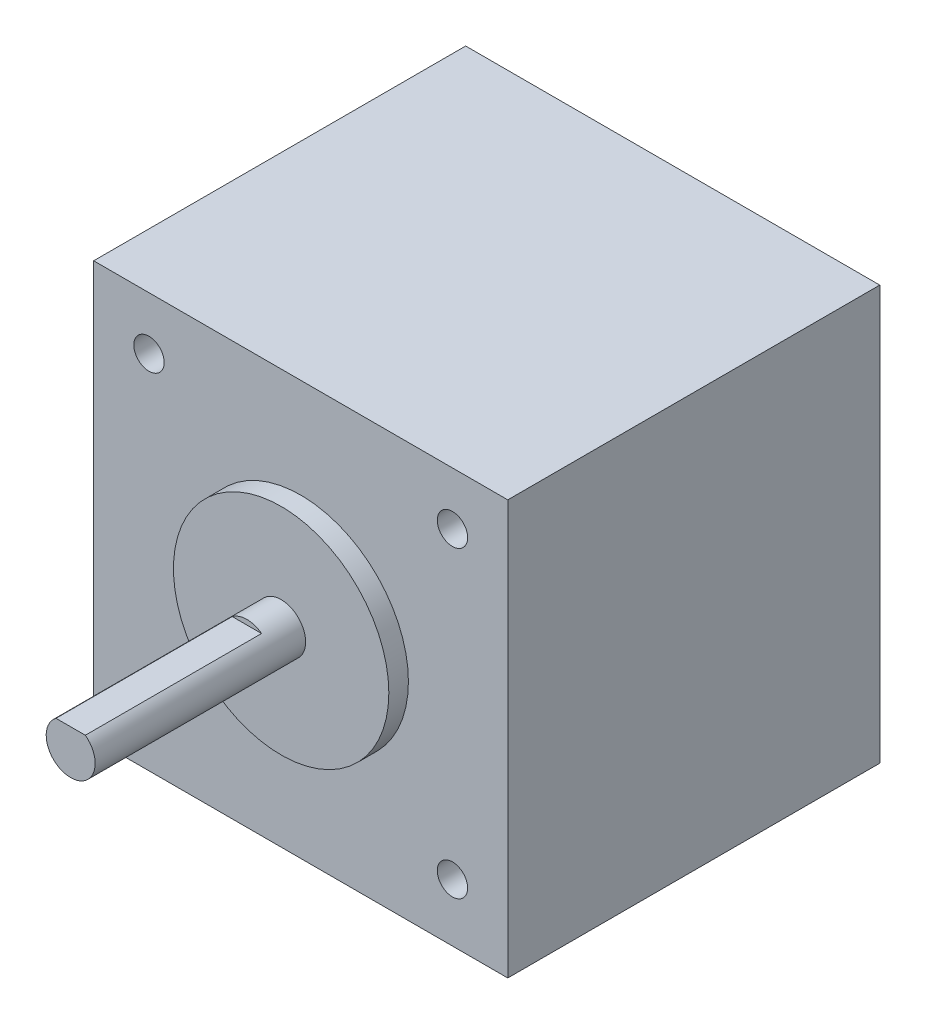
ISO-10303-21;
HEADER;
FILE_DESCRIPTION(('STEP AP214'),'2;1');
FILE_NAME('part.step','',(''),(''),'','','');
FILE_SCHEMA(('AUTOMOTIVE_DESIGN { 1 0 10303 214 1 1 1 1 }'));
ENDSEC;
DATA;
#1=APPLICATION_CONTEXT('core data for automotive mechanical design processes');
#2=APPLICATION_PROTOCOL_DEFINITION('international standard','automotive_design',2000,#1);
#3=PRODUCT_CONTEXT('',#1,'mechanical');
#4=PRODUCT('Part','Part','',(#3));
#5=PRODUCT_RELATED_PRODUCT_CATEGORY('part','',(#4));
#6=PRODUCT_DEFINITION_FORMATION('','',#4);
#7=PRODUCT_DEFINITION_CONTEXT('part definition',#1,'design');
#8=PRODUCT_DEFINITION('design','',#6,#7);
#9=PRODUCT_DEFINITION_SHAPE('','',#8);
#10=(LENGTH_UNIT() NAMED_UNIT(*) SI_UNIT(.MILLI.,.METRE.));
#11=(NAMED_UNIT(*) PLANE_ANGLE_UNIT() SI_UNIT($,.RADIAN.));
#12=(NAMED_UNIT(*) SI_UNIT($,.STERADIAN.) SOLID_ANGLE_UNIT());
#13=UNCERTAINTY_MEASURE_WITH_UNIT(LENGTH_MEASURE(1.E-05),#10,'distance_accuracy_value','');
#14=(GEOMETRIC_REPRESENTATION_CONTEXT(3) GLOBAL_UNCERTAINTY_ASSIGNED_CONTEXT((#13)) GLOBAL_UNIT_ASSIGNED_CONTEXT((#10,
#11,#12)) REPRESENTATION_CONTEXT('',''));
#15=CARTESIAN_POINT('',(0.,0.,0.));
#16=DIRECTION('',(0.,0.,1.));
#17=DIRECTION('',(1.,0.,0.));
#18=AXIS2_PLACEMENT_3D('',#15,#16,#17);
#19=CARTESIAN_POINT('',(0.,0.,38.));
#20=DIRECTION('',(1.,0.,0.));
#21=DIRECTION('',(0.,0.,-1.));
#22=AXIS2_PLACEMENT_3D('',#19,#20,#21);
#23=PLANE('',#22);
#24=DIRECTION('',(0.,-1.,0.));
#25=VECTOR('',#24,1.);
#26=CARTESIAN_POINT('',(0.,0.,0.));
#27=LINE('',#26,#25);
#28=CARTESIAN_POINT('',(0.,42.3,0.));
#29=VERTEX_POINT('',#28);
#30=CARTESIAN_POINT('',(0.,0.,0.));
#31=VERTEX_POINT('',#30);
#32=EDGE_CURVE('E122',#29,#31,#27,.T.);
#33=ORIENTED_EDGE('',*,*,#32,.T.);
#34=DIRECTION('',(0.,0.,-1.));
#35=VECTOR('',#34,1.);
#36=CARTESIAN_POINT('',(0.,0.,38.));
#37=LINE('',#36,#35);
#38=CARTESIAN_POINT('',(0.,0.,38.));
#39=VERTEX_POINT('',#38);
#40=EDGE_CURVE('E36',#39,#31,#37,.T.);
#41=ORIENTED_EDGE('',*,*,#40,.F.);
#42=DIRECTION('',(0.,-1.,0.));
#43=VECTOR('',#42,1.);
#44=CARTESIAN_POINT('',(0.,0.,38.));
#45=LINE('',#44,#43);
#46=CARTESIAN_POINT('',(0.,42.3,38.));
#47=VERTEX_POINT('',#46);
#48=EDGE_CURVE('E125',#47,#39,#45,.T.);
#49=ORIENTED_EDGE('',*,*,#48,.F.);
#50=DIRECTION('',(0.,0.,-1.));
#51=VECTOR('',#50,1.);
#52=CARTESIAN_POINT('',(0.,42.3,38.));
#53=LINE('',#52,#51);
#54=EDGE_CURVE('E79',#47,#29,#53,.T.);
#55=ORIENTED_EDGE('',*,*,#54,.T.);
#56=EDGE_LOOP('',(#33,#41,#49,#55));
#57=FACE_BOUND('',#56,.T.);
#58=ADVANCED_FACE('F33',(#57),#23,.F.);
#59=CARTESIAN_POINT('',(0.,0.,38.));
#60=DIRECTION('',(0.,1.,0.));
#61=DIRECTION('',(0.,0.,1.));
#62=AXIS2_PLACEMENT_3D('',#59,#60,#61);
#63=PLANE('',#62);
#64=DIRECTION('',(1.,0.,0.));
#65=VECTOR('',#64,1.);
#66=CARTESIAN_POINT('',(0.,0.,0.));
#67=LINE('',#66,#65);
#68=CARTESIAN_POINT('',(42.3,0.,0.));
#69=VERTEX_POINT('',#68);
#70=EDGE_CURVE('E133',#31,#69,#67,.T.);
#71=ORIENTED_EDGE('',*,*,#70,.T.);
#72=DIRECTION('',(0.,0.,-1.));
#73=VECTOR('',#72,1.);
#74=CARTESIAN_POINT('',(42.3,0.,38.));
#75=LINE('',#74,#73);
#76=CARTESIAN_POINT('',(42.3,0.,38.));
#77=VERTEX_POINT('',#76);
#78=EDGE_CURVE('E142',#77,#69,#75,.T.);
#79=ORIENTED_EDGE('',*,*,#78,.F.);
#80=DIRECTION('',(1.,0.,0.));
#81=VECTOR('',#80,1.);
#82=CARTESIAN_POINT('',(0.,0.,38.));
#83=LINE('',#82,#81);
#84=EDGE_CURVE('E86',#39,#77,#83,.T.);
#85=ORIENTED_EDGE('',*,*,#84,.F.);
#86=ORIENTED_EDGE('',*,*,#40,.T.);
#87=EDGE_LOOP('',(#71,#79,#85,#86));
#88=FACE_BOUND('',#87,.T.);
#89=ADVANCED_FACE('F147',(#88),#63,.F.);
#90=CARTESIAN_POINT('',(42.3,0.,38.));
#91=DIRECTION('',(-1.,0.,0.));
#92=DIRECTION('',(0.,0.,1.));
#93=AXIS2_PLACEMENT_3D('',#90,#91,#92);
#94=PLANE('',#93);
#95=DIRECTION('',(0.,1.,0.));
#96=VECTOR('',#95,1.);
#97=CARTESIAN_POINT('',(42.3,0.,0.));
#98=LINE('',#97,#96);
#99=CARTESIAN_POINT('',(42.3,42.3,0.));
#100=VERTEX_POINT('',#99);
#101=EDGE_CURVE('E136',#69,#100,#98,.T.);
#102=ORIENTED_EDGE('',*,*,#101,.T.);
#103=DIRECTION('',(0.,0.,-1.));
#104=VECTOR('',#103,1.);
#105=CARTESIAN_POINT('',(42.3,42.3,38.));
#106=LINE('',#105,#104);
#107=CARTESIAN_POINT('',(42.3,42.3,38.));
#108=VERTEX_POINT('',#107);
#109=EDGE_CURVE('E141',#108,#100,#106,.T.);
#110=ORIENTED_EDGE('',*,*,#109,.F.);
#111=DIRECTION('',(0.,1.,0.));
#112=VECTOR('',#111,1.);
#113=CARTESIAN_POINT('',(42.3,0.,38.));
#114=LINE('',#113,#112);
#115=EDGE_CURVE('E129',#77,#108,#114,.T.);
#116=ORIENTED_EDGE('',*,*,#115,.F.);
#117=ORIENTED_EDGE('',*,*,#78,.T.);
#118=EDGE_LOOP('',(#102,#110,#116,#117));
#119=FACE_BOUND('',#118,.T.);
#120=ADVANCED_FACE('F157',(#119),#94,.F.);
#121=CARTESIAN_POINT('',(0.,42.3,38.));
#122=DIRECTION('',(0.,-1.,0.));
#123=DIRECTION('',(0.,0.,-1.));
#124=AXIS2_PLACEMENT_3D('',#121,#122,#123);
#125=PLANE('',#124);
#126=DIRECTION('',(-1.,0.,0.));
#127=VECTOR('',#126,1.);
#128=CARTESIAN_POINT('',(0.,42.3,0.));
#129=LINE('',#128,#127);
#130=EDGE_CURVE('E127',#100,#29,#129,.T.);
#131=ORIENTED_EDGE('',*,*,#130,.T.);
#132=ORIENTED_EDGE('',*,*,#54,.F.);
#133=DIRECTION('',(-1.,0.,0.));
#134=VECTOR('',#133,1.);
#135=CARTESIAN_POINT('',(0.,42.3,38.));
#136=LINE('',#135,#134);
#137=EDGE_CURVE('E58',#108,#47,#136,.T.);
#138=ORIENTED_EDGE('',*,*,#137,.F.);
#139=ORIENTED_EDGE('',*,*,#109,.T.);
#140=EDGE_LOOP('',(#131,#132,#138,#139));
#141=FACE_BOUND('',#140,.T.);
#142=ADVANCED_FACE('F161',(#141),#125,.F.);
#143=CARTESIAN_POINT('',(0.,0.,38.));
#144=DIRECTION('',(0.,0.,-1.));
#145=DIRECTION('',(-1.,0.,0.));
#146=AXIS2_PLACEMENT_3D('',#143,#144,#145);
#147=PLANE('',#146);
#148=CARTESIAN_POINT('',(5.65,5.9,38.));
#149=DIRECTION('',(0.,0.,1.));
#150=DIRECTION('',(1.,0.,0.));
#151=AXIS2_PLACEMENT_3D('',#148,#149,#150);
#152=CIRCLE('',#151,1.55);
#153=CARTESIAN_POINT('',(7.2,5.9,38.));
#154=VERTEX_POINT('',#153);
#155=EDGE_CURVE('E281',#154,#154,#152,.T.);
#156=ORIENTED_EDGE('',*,*,#155,.F.);
#157=EDGE_LOOP('',(#156));
#158=FACE_BOUND('',#157,.T.);
#159=CARTESIAN_POINT('',(36.65,5.9,38.));
#160=DIRECTION('',(0.,0.,1.));
#161=DIRECTION('',(1.,0.,0.));
#162=AXIS2_PLACEMENT_3D('',#159,#160,#161);
#163=CIRCLE('',#162,1.55);
#164=CARTESIAN_POINT('',(38.2,5.9,38.));
#165=VERTEX_POINT('',#164);
#166=EDGE_CURVE('E294',#165,#165,#163,.T.);
#167=ORIENTED_EDGE('',*,*,#166,.F.);
#168=EDGE_LOOP('',(#167));
#169=FACE_BOUND('',#168,.T.);
#170=CARTESIAN_POINT('',(36.65,36.9,38.));
#171=DIRECTION('',(0.,0.,1.));
#172=DIRECTION('',(1.,0.,0.));
#173=AXIS2_PLACEMENT_3D('',#170,#171,#172);
#174=CIRCLE('',#173,1.55);
#175=CARTESIAN_POINT('',(38.2,36.9,38.));
#176=VERTEX_POINT('',#175);
#177=EDGE_CURVE('E288',#176,#176,#174,.T.);
#178=ORIENTED_EDGE('',*,*,#177,.F.);
#179=EDGE_LOOP('',(#178));
#180=FACE_BOUND('',#179,.T.);
#181=CARTESIAN_POINT('',(5.65,36.9,38.));
#182=DIRECTION('',(0.,0.,1.));
#183=DIRECTION('',(1.,0.,0.));
#184=AXIS2_PLACEMENT_3D('',#181,#182,#183);
#185=CIRCLE('',#184,1.55);
#186=CARTESIAN_POINT('',(7.2,36.9,38.));
#187=VERTEX_POINT('',#186);
#188=EDGE_CURVE('E287',#187,#187,#185,.T.);
#189=ORIENTED_EDGE('',*,*,#188,.F.);
#190=EDGE_LOOP('',(#189));
#191=FACE_BOUND('',#190,.T.);
#192=CARTESIAN_POINT('',(21.15,21.15,38.));
#193=DIRECTION('',(0.,0.,1.));
#194=DIRECTION('',(1.,0.,0.));
#195=AXIS2_PLACEMENT_3D('',#192,#193,#194);
#196=CIRCLE('',#195,11.);
#197=CARTESIAN_POINT('',(32.15,21.15,38.));
#198=VERTEX_POINT('',#197);
#199=EDGE_CURVE('E41',#198,#198,#196,.T.);
#200=ORIENTED_EDGE('',*,*,#199,.F.);
#201=EDGE_LOOP('',(#200));
#202=FACE_BOUND('',#201,.T.);
#203=ORIENTED_EDGE('',*,*,#48,.T.);
#204=ORIENTED_EDGE('',*,*,#84,.T.);
#205=ORIENTED_EDGE('',*,*,#115,.T.);
#206=ORIENTED_EDGE('',*,*,#137,.T.);
#207=EDGE_LOOP('',(#203,#204,#205,#206));
#208=FACE_BOUND('',#207,.T.);
#209=ADVANCED_FACE('F166',(#158,#169,#180,#191,#202,#208),#147,.F.);
#210=CARTESIAN_POINT('',(0.,0.,0.));
#211=DIRECTION('',(0.,0.,-1.));
#212=DIRECTION('',(-1.,0.,0.));
#213=AXIS2_PLACEMENT_3D('',#210,#211,#212);
#214=PLANE('',#213);
#215=CARTESIAN_POINT('',(36.65,36.9,0.));
#216=DIRECTION('',(0.,0.,-1.));
#217=DIRECTION('',(-1.,0.,0.));
#218=AXIS2_PLACEMENT_3D('',#215,#216,#217);
#219=CIRCLE('',#218,1.55);
#220=CARTESIAN_POINT('',(35.1,36.9,0.));
#221=VERTEX_POINT('',#220);
#222=EDGE_CURVE('E273',#221,#221,#219,.T.);
#223=ORIENTED_EDGE('',*,*,#222,.F.);
#224=EDGE_LOOP('',(#223));
#225=FACE_BOUND('',#224,.T.);
#226=CARTESIAN_POINT('',(36.65,5.9,0.));
#227=DIRECTION('',(0.,0.,-1.));
#228=DIRECTION('',(-1.,0.,0.));
#229=AXIS2_PLACEMENT_3D('',#226,#227,#228);
#230=CIRCLE('',#229,1.55);
#231=CARTESIAN_POINT('',(35.1,5.9,0.));
#232=VERTEX_POINT('',#231);
#233=EDGE_CURVE('E260',#232,#232,#230,.T.);
#234=ORIENTED_EDGE('',*,*,#233,.F.);
#235=EDGE_LOOP('',(#234));
#236=FACE_BOUND('',#235,.T.);
#237=CARTESIAN_POINT('',(5.65,5.9,0.));
#238=DIRECTION('',(0.,0.,-1.));
#239=DIRECTION('',(-1.,0.,0.));
#240=AXIS2_PLACEMENT_3D('',#237,#238,#239);
#241=CIRCLE('',#240,1.55);
#242=CARTESIAN_POINT('',(4.1,5.9,0.));
#243=VERTEX_POINT('',#242);
#244=EDGE_CURVE('E261',#243,#243,#241,.T.);
#245=ORIENTED_EDGE('',*,*,#244,.F.);
#246=EDGE_LOOP('',(#245));
#247=FACE_BOUND('',#246,.T.);
#248=CARTESIAN_POINT('',(5.65,36.9,0.));
#249=DIRECTION('',(0.,0.,-1.));
#250=DIRECTION('',(-1.,0.,0.));
#251=AXIS2_PLACEMENT_3D('',#248,#249,#250);
#252=CIRCLE('',#251,1.55);
#253=CARTESIAN_POINT('',(4.1,36.9,0.));
#254=VERTEX_POINT('',#253);
#255=EDGE_CURVE('E272',#254,#254,#252,.T.);
#256=ORIENTED_EDGE('',*,*,#255,.F.);
#257=EDGE_LOOP('',(#256));
#258=FACE_BOUND('',#257,.T.);
#259=ORIENTED_EDGE('',*,*,#32,.F.);
#260=ORIENTED_EDGE('',*,*,#130,.F.);
#261=ORIENTED_EDGE('',*,*,#101,.F.);
#262=ORIENTED_EDGE('',*,*,#70,.F.);
#263=EDGE_LOOP('',(#259,#260,#261,#262));
#264=FACE_BOUND('',#263,.T.);
#265=ADVANCED_FACE('F151',(#225,#236,#247,#258,#264),#214,.T.);
#266=CARTESIAN_POINT('',(21.15,21.15,40.));
#267=DIRECTION('',(0.,0.,-1.));
#268=DIRECTION('',(-1.,0.,0.));
#269=AXIS2_PLACEMENT_3D('',#266,#267,#268);
#270=CYLINDRICAL_SURFACE('',#269,11.);
#271=CARTESIAN_POINT('',(21.15,21.15,40.));
#272=DIRECTION('',(0.,0.,1.));
#273=DIRECTION('',(1.,0.,0.));
#274=AXIS2_PLACEMENT_3D('',#271,#272,#273);
#275=CIRCLE('',#274,11.);
#276=CARTESIAN_POINT('',(32.15,21.15,40.));
#277=VERTEX_POINT('',#276);
#278=EDGE_CURVE('E118',#277,#277,#275,.T.);
#279=ORIENTED_EDGE('',*,*,#278,.F.);
#280=EDGE_LOOP('',(#279));
#281=FACE_BOUND('',#280,.T.);
#282=ORIENTED_EDGE('',*,*,#199,.T.);
#283=EDGE_LOOP('',(#282));
#284=FACE_BOUND('',#283,.T.);
#285=ADVANCED_FACE('F170',(#281,#284),#270,.T.);
#286=CARTESIAN_POINT('',(21.15,21.15,40.));
#287=DIRECTION('',(0.,0.,1.));
#288=DIRECTION('',(1.,0.,0.));
#289=AXIS2_PLACEMENT_3D('',#286,#287,#288);
#290=PLANE('',#289);
#291=CARTESIAN_POINT('',(21.15,21.4,40.));
#292=DIRECTION('',(0.,0.,1.));
#293=DIRECTION('',(1.,0.,0.));
#294=AXIS2_PLACEMENT_3D('',#291,#292,#293);
#295=CIRCLE('',#294,2.5);
#296=CARTESIAN_POINT('',(23.65,21.4,40.));
#297=VERTEX_POINT('',#296);
#298=EDGE_CURVE('E12',#297,#297,#295,.T.);
#299=ORIENTED_EDGE('',*,*,#298,.F.);
#300=EDGE_LOOP('',(#299));
#301=FACE_BOUND('',#300,.T.);
#302=ORIENTED_EDGE('',*,*,#278,.T.);
#303=EDGE_LOOP('',(#302));
#304=FACE_BOUND('',#303,.T.);
#305=ADVANCED_FACE('F177',(#301,#304),#290,.T.);
#306=CARTESIAN_POINT('',(21.15,21.4,61.5));
#307=DIRECTION('',(0.,0.,-1.));
#308=DIRECTION('',(-1.,0.,0.));
#309=AXIS2_PLACEMENT_3D('',#306,#307,#308);
#310=CYLINDRICAL_SURFACE('',#309,2.5);
#311=CARTESIAN_POINT('',(21.15,21.4,61.5));
#312=DIRECTION('',(0.,0.,1.));
#313=DIRECTION('',(1.,0.,0.));
#314=AXIS2_PLACEMENT_3D('',#311,#312,#313);
#315=CIRCLE('',#314,2.5);
#316=CARTESIAN_POINT('',(19.65,23.4,61.5));
#317=VERTEX_POINT('',#316);
#318=CARTESIAN_POINT('',(22.65,23.4,61.5));
#319=VERTEX_POINT('',#318);
#320=EDGE_CURVE('E116',#317,#319,#315,.T.);
#321=ORIENTED_EDGE('',*,*,#320,.F.);
#322=DIRECTION('',(0.,0.,1.));
#323=VECTOR('',#322,1.);
#324=CARTESIAN_POINT('',(19.65,23.4,43.5));
#325=LINE('',#324,#323);
#326=CARTESIAN_POINT('',(19.65,23.4,43.5));
#327=VERTEX_POINT('',#326);
#328=EDGE_CURVE('E49',#327,#317,#325,.T.);
#329=ORIENTED_EDGE('',*,*,#328,.F.);
#330=CARTESIAN_POINT('',(21.15,21.4,43.5));
#331=DIRECTION('',(0.,0.,1.));
#332=DIRECTION('',(1.,0.,0.));
#333=AXIS2_PLACEMENT_3D('',#330,#331,#332);
#334=CIRCLE('',#333,2.5);
#335=CARTESIAN_POINT('',(22.65,23.4,43.5));
#336=VERTEX_POINT('',#335);
#337=EDGE_CURVE('E99',#336,#327,#334,.T.);
#338=ORIENTED_EDGE('',*,*,#337,.F.);
#339=DIRECTION('',(0.,0.,1.));
#340=VECTOR('',#339,1.);
#341=CARTESIAN_POINT('',(22.65,23.4,43.5));
#342=LINE('',#341,#340);
#343=EDGE_CURVE('E103',#336,#319,#342,.T.);
#344=ORIENTED_EDGE('',*,*,#343,.T.);
#345=EDGE_LOOP('',(#321,#329,#338,#344));
#346=FACE_BOUND('',#345,.T.);
#347=ORIENTED_EDGE('',*,*,#298,.T.);
#348=EDGE_LOOP('',(#347));
#349=FACE_BOUND('',#348,.T.);
#350=ADVANCED_FACE('F109',(#346,#349),#310,.T.);
#351=CARTESIAN_POINT('',(21.15,21.4,61.5));
#352=DIRECTION('',(0.,0.,1.));
#353=DIRECTION('',(1.,0.,0.));
#354=AXIS2_PLACEMENT_3D('',#351,#352,#353);
#355=PLANE('',#354);
#356=DIRECTION('',(1.,0.,0.));
#357=VECTOR('',#356,1.);
#358=CARTESIAN_POINT('',(21.15,23.4,61.5));
#359=LINE('',#358,#357);
#360=EDGE_CURVE('E100',#317,#319,#359,.T.);
#361=ORIENTED_EDGE('',*,*,#360,.F.);
#362=ORIENTED_EDGE('',*,*,#320,.T.);
#363=EDGE_LOOP('',(#361,#362));
#364=FACE_BOUND('',#363,.T.);
#365=ADVANCED_FACE('F184',(#364),#355,.T.);
#366=CARTESIAN_POINT('',(21.15,23.4,43.5));
#367=DIRECTION('',(0.,-1.,0.));
#368=DIRECTION('',(0.,0.,-1.));
#369=AXIS2_PLACEMENT_3D('',#366,#367,#368);
#370=PLANE('',#369);
#371=ORIENTED_EDGE('',*,*,#360,.T.);
#372=ORIENTED_EDGE('',*,*,#343,.F.);
#373=DIRECTION('',(1.,0.,0.));
#374=VECTOR('',#373,1.);
#375=CARTESIAN_POINT('',(21.15,23.4,43.5));
#376=LINE('',#375,#374);
#377=EDGE_CURVE('E95',#327,#336,#376,.T.);
#378=ORIENTED_EDGE('',*,*,#377,.F.);
#379=ORIENTED_EDGE('',*,*,#328,.T.);
#380=EDGE_LOOP('',(#371,#372,#378,#379));
#381=FACE_BOUND('',#380,.T.);
#382=ADVANCED_FACE('F104',(#381),#370,.F.);
#383=CARTESIAN_POINT('',(21.15,21.4,43.5));
#384=DIRECTION('',(0.,0.,1.));
#385=DIRECTION('',(1.,0.,0.));
#386=AXIS2_PLACEMENT_3D('',#383,#384,#385);
#387=PLANE('',#386);
#388=ORIENTED_EDGE('',*,*,#377,.T.);
#389=ORIENTED_EDGE('',*,*,#337,.T.);
#390=EDGE_LOOP('',(#388,#389));
#391=FACE_BOUND('',#390,.T.);
#392=ADVANCED_FACE('F97',(#391),#387,.T.);
#393=CARTESIAN_POINT('',(5.65,36.9,33.5));
#394=DIRECTION('',(0.,0.,1.));
#395=DIRECTION('',(1.,0.,0.));
#396=AXIS2_PLACEMENT_3D('',#393,#394,#395);
#397=CYLINDRICAL_SURFACE('',#396,1.55);
#398=CARTESIAN_POINT('',(5.65,36.9,33.5));
#399=DIRECTION('',(0.,0.,1.));
#400=DIRECTION('',(1.,0.,0.));
#401=AXIS2_PLACEMENT_3D('',#398,#399,#400);
#402=CIRCLE('',#401,1.55);
#403=CARTESIAN_POINT('',(7.2,36.9,33.5));
#404=VERTEX_POINT('',#403);
#405=EDGE_CURVE('E115',#404,#404,#402,.T.);
#406=ORIENTED_EDGE('',*,*,#405,.F.);
#407=EDGE_LOOP('',(#406));
#408=FACE_BOUND('',#407,.T.);
#409=ORIENTED_EDGE('',*,*,#188,.T.);
#410=EDGE_LOOP('',(#409));
#411=FACE_BOUND('',#410,.T.);
#412=ADVANCED_FACE('F192',(#408,#411),#397,.F.);
#413=CARTESIAN_POINT('',(5.65,36.9,33.5));
#414=DIRECTION('',(0.,0.,1.));
#415=DIRECTION('',(1.,0.,0.));
#416=AXIS2_PLACEMENT_3D('',#413,#414,#415);
#417=PLANE('',#416);
#418=ORIENTED_EDGE('',*,*,#405,.T.);
#419=EDGE_LOOP('',(#418));
#420=FACE_BOUND('',#419,.T.);
#421=ADVANCED_FACE('F195',(#420),#417,.T.);
#422=CARTESIAN_POINT('',(36.65,36.9,33.5));
#423=DIRECTION('',(0.,0.,1.));
#424=DIRECTION('',(1.,0.,0.));
#425=AXIS2_PLACEMENT_3D('',#422,#423,#424);
#426=CYLINDRICAL_SURFACE('',#425,1.55);
#427=CARTESIAN_POINT('',(36.65,36.9,33.5));
#428=DIRECTION('',(0.,0.,1.));
#429=DIRECTION('',(1.,0.,0.));
#430=AXIS2_PLACEMENT_3D('',#427,#428,#429);
#431=CIRCLE('',#430,1.55);
#432=CARTESIAN_POINT('',(38.2,36.9,33.5));
#433=VERTEX_POINT('',#432);
#434=EDGE_CURVE('E284',#433,#433,#431,.T.);
#435=ORIENTED_EDGE('',*,*,#434,.F.);
#436=EDGE_LOOP('',(#435));
#437=FACE_BOUND('',#436,.T.);
#438=ORIENTED_EDGE('',*,*,#177,.T.);
#439=EDGE_LOOP('',(#438));
#440=FACE_BOUND('',#439,.T.);
#441=ADVANCED_FACE('F199',(#437,#440),#426,.F.);
#442=CARTESIAN_POINT('',(36.65,36.9,33.5));
#443=DIRECTION('',(0.,0.,1.));
#444=DIRECTION('',(1.,0.,0.));
#445=AXIS2_PLACEMENT_3D('',#442,#443,#444);
#446=PLANE('',#445);
#447=ORIENTED_EDGE('',*,*,#434,.T.);
#448=EDGE_LOOP('',(#447));
#449=FACE_BOUND('',#448,.T.);
#450=ADVANCED_FACE('F214',(#449),#446,.T.);
#451=CARTESIAN_POINT('',(36.65,5.9,33.5));
#452=DIRECTION('',(0.,0.,1.));
#453=DIRECTION('',(1.,0.,0.));
#454=AXIS2_PLACEMENT_3D('',#451,#452,#453);
#455=CYLINDRICAL_SURFACE('',#454,1.55);
#456=CARTESIAN_POINT('',(36.65,5.9,33.5));
#457=DIRECTION('',(0.,0.,1.));
#458=DIRECTION('',(1.,0.,0.));
#459=AXIS2_PLACEMENT_3D('',#456,#457,#458);
#460=CIRCLE('',#459,1.55);
#461=CARTESIAN_POINT('',(38.2,5.9,33.5));
#462=VERTEX_POINT('',#461);
#463=EDGE_CURVE('E291',#462,#462,#460,.T.);
#464=ORIENTED_EDGE('',*,*,#463,.F.);
#465=EDGE_LOOP('',(#464));
#466=FACE_BOUND('',#465,.T.);
#467=ORIENTED_EDGE('',*,*,#166,.T.);
#468=EDGE_LOOP('',(#467));
#469=FACE_BOUND('',#468,.T.);
#470=ADVANCED_FACE('F211',(#466,#469),#455,.F.);
#471=CARTESIAN_POINT('',(36.65,5.9,33.5));
#472=DIRECTION('',(0.,0.,1.));
#473=DIRECTION('',(1.,0.,0.));
#474=AXIS2_PLACEMENT_3D('',#471,#472,#473);
#475=PLANE('',#474);
#476=ORIENTED_EDGE('',*,*,#463,.T.);
#477=EDGE_LOOP('',(#476));
#478=FACE_BOUND('',#477,.T.);
#479=ADVANCED_FACE('F205',(#478),#475,.T.);
#480=CARTESIAN_POINT('',(5.65,5.9,33.5));
#481=DIRECTION('',(0.,0.,1.));
#482=DIRECTION('',(1.,0.,0.));
#483=AXIS2_PLACEMENT_3D('',#480,#481,#482);
#484=CYLINDRICAL_SURFACE('',#483,1.55);
#485=CARTESIAN_POINT('',(5.65,5.9,33.5));
#486=DIRECTION('',(0.,0.,1.));
#487=DIRECTION('',(1.,0.,0.));
#488=AXIS2_PLACEMENT_3D('',#485,#486,#487);
#489=CIRCLE('',#488,1.55);
#490=CARTESIAN_POINT('',(7.2,5.9,33.5));
#491=VERTEX_POINT('',#490);
#492=EDGE_CURVE('E297',#491,#491,#489,.T.);
#493=ORIENTED_EDGE('',*,*,#492,.F.);
#494=EDGE_LOOP('',(#493));
#495=FACE_BOUND('',#494,.T.);
#496=ORIENTED_EDGE('',*,*,#155,.T.);
#497=EDGE_LOOP('',(#496));
#498=FACE_BOUND('',#497,.T.);
#499=ADVANCED_FACE('F201',(#495,#498),#484,.F.);
#500=CARTESIAN_POINT('',(5.65,5.9,33.5));
#501=DIRECTION('',(0.,0.,1.));
#502=DIRECTION('',(1.,0.,0.));
#503=AXIS2_PLACEMENT_3D('',#500,#501,#502);
#504=PLANE('',#503);
#505=ORIENTED_EDGE('',*,*,#492,.T.);
#506=EDGE_LOOP('',(#505));
#507=FACE_BOUND('',#506,.T.);
#508=ADVANCED_FACE('F204',(#507),#504,.T.);
#509=CARTESIAN_POINT('',(5.65,36.9,4.5));
#510=DIRECTION('',(0.,0.,-1.));
#511=DIRECTION('',(-1.,0.,0.));
#512=AXIS2_PLACEMENT_3D('',#509,#510,#511);
#513=CYLINDRICAL_SURFACE('',#512,1.55);
#514=CARTESIAN_POINT('',(5.65,36.9,4.5));
#515=DIRECTION('',(0.,0.,-1.));
#516=DIRECTION('',(-1.,0.,0.));
#517=AXIS2_PLACEMENT_3D('',#514,#515,#516);
#518=CIRCLE('',#517,1.55);
#519=CARTESIAN_POINT('',(4.1,36.9,4.5));
#520=VERTEX_POINT('',#519);
#521=EDGE_CURVE('E278',#520,#520,#518,.T.);
#522=ORIENTED_EDGE('',*,*,#521,.F.);
#523=EDGE_LOOP('',(#522));
#524=FACE_BOUND('',#523,.T.);
#525=ORIENTED_EDGE('',*,*,#255,.T.);
#526=EDGE_LOOP('',(#525));
#527=FACE_BOUND('',#526,.T.);
#528=ADVANCED_FACE('F209',(#524,#527),#513,.F.);
#529=CARTESIAN_POINT('',(5.65,36.9,4.5));
#530=DIRECTION('',(0.,0.,-1.));
#531=DIRECTION('',(-1.,0.,0.));
#532=AXIS2_PLACEMENT_3D('',#529,#530,#531);
#533=PLANE('',#532);
#534=ORIENTED_EDGE('',*,*,#521,.T.);
#535=EDGE_LOOP('',(#534));
#536=FACE_BOUND('',#535,.T.);
#537=ADVANCED_FACE('F227',(#536),#533,.T.);
#538=CARTESIAN_POINT('',(5.65,5.9,4.5));
#539=DIRECTION('',(0.,0.,-1.));
#540=DIRECTION('',(-1.,0.,0.));
#541=AXIS2_PLACEMENT_3D('',#538,#539,#540);
#542=CYLINDRICAL_SURFACE('',#541,1.55);
#543=CARTESIAN_POINT('',(5.65,5.9,4.5));
#544=DIRECTION('',(0.,0.,-1.));
#545=DIRECTION('',(-1.,0.,0.));
#546=AXIS2_PLACEMENT_3D('',#543,#544,#545);
#547=CIRCLE('',#546,1.55);
#548=CARTESIAN_POINT('',(4.1,5.9,4.5));
#549=VERTEX_POINT('',#548);
#550=EDGE_CURVE('E259',#549,#549,#547,.T.);
#551=ORIENTED_EDGE('',*,*,#550,.F.);
#552=EDGE_LOOP('',(#551));
#553=FACE_BOUND('',#552,.T.);
#554=ORIENTED_EDGE('',*,*,#244,.T.);
#555=EDGE_LOOP('',(#554));
#556=FACE_BOUND('',#555,.T.);
#557=ADVANCED_FACE('F231',(#553,#556),#542,.F.);
#558=CARTESIAN_POINT('',(5.65,5.9,4.5));
#559=DIRECTION('',(0.,0.,-1.));
#560=DIRECTION('',(-1.,0.,0.));
#561=AXIS2_PLACEMENT_3D('',#558,#559,#560);
#562=PLANE('',#561);
#563=ORIENTED_EDGE('',*,*,#550,.T.);
#564=EDGE_LOOP('',(#563));
#565=FACE_BOUND('',#564,.T.);
#566=ADVANCED_FACE('F237',(#565),#562,.T.);
#567=CARTESIAN_POINT('',(36.65,5.9,4.5));
#568=DIRECTION('',(0.,0.,-1.));
#569=DIRECTION('',(-1.,0.,0.));
#570=AXIS2_PLACEMENT_3D('',#567,#568,#569);
#571=CYLINDRICAL_SURFACE('',#570,1.55);
#572=CARTESIAN_POINT('',(36.65,5.9,4.5));
#573=DIRECTION('',(0.,0.,-1.));
#574=DIRECTION('',(-1.,0.,0.));
#575=AXIS2_PLACEMENT_3D('',#572,#573,#574);
#576=CIRCLE('',#575,1.55);
#577=CARTESIAN_POINT('',(35.1,5.9,4.5));
#578=VERTEX_POINT('',#577);
#579=EDGE_CURVE('E264',#578,#578,#576,.T.);
#580=ORIENTED_EDGE('',*,*,#579,.F.);
#581=EDGE_LOOP('',(#580));
#582=FACE_BOUND('',#581,.T.);
#583=ORIENTED_EDGE('',*,*,#233,.T.);
#584=EDGE_LOOP('',(#583));
#585=FACE_BOUND('',#584,.T.);
#586=ADVANCED_FACE('F233',(#582,#585),#571,.F.);
#587=CARTESIAN_POINT('',(36.65,5.9,4.5));
#588=DIRECTION('',(0.,0.,-1.));
#589=DIRECTION('',(-1.,0.,0.));
#590=AXIS2_PLACEMENT_3D('',#587,#588,#589);
#591=PLANE('',#590);
#592=ORIENTED_EDGE('',*,*,#579,.T.);
#593=EDGE_LOOP('',(#592));
#594=FACE_BOUND('',#593,.T.);
#595=ADVANCED_FACE('F236',(#594),#591,.T.);
#596=CARTESIAN_POINT('',(36.65,36.9,4.5));
#597=DIRECTION('',(0.,0.,-1.));
#598=DIRECTION('',(-1.,0.,0.));
#599=AXIS2_PLACEMENT_3D('',#596,#597,#598);
#600=CYLINDRICAL_SURFACE('',#599,1.55);
#601=CARTESIAN_POINT('',(36.65,36.9,4.5));
#602=DIRECTION('',(0.,0.,-1.));
#603=DIRECTION('',(-1.,0.,0.));
#604=AXIS2_PLACEMENT_3D('',#601,#602,#603);
#605=CIRCLE('',#604,1.55);
#606=CARTESIAN_POINT('',(35.1,36.9,4.5));
#607=VERTEX_POINT('',#606);
#608=EDGE_CURVE('E269',#607,#607,#605,.T.);
#609=ORIENTED_EDGE('',*,*,#608,.F.);
#610=EDGE_LOOP('',(#609));
#611=FACE_BOUND('',#610,.T.);
#612=ORIENTED_EDGE('',*,*,#222,.T.);
#613=EDGE_LOOP('',(#612));
#614=FACE_BOUND('',#613,.T.);
#615=ADVANCED_FACE('F241',(#611,#614),#600,.F.);
#616=CARTESIAN_POINT('',(36.65,36.9,4.5));
#617=DIRECTION('',(0.,0.,-1.));
#618=DIRECTION('',(-1.,0.,0.));
#619=AXIS2_PLACEMENT_3D('',#616,#617,#618);
#620=PLANE('',#619);
#621=ORIENTED_EDGE('',*,*,#608,.T.);
#622=EDGE_LOOP('',(#621));
#623=FACE_BOUND('',#622,.T.);
#624=ADVANCED_FACE('F245',(#623),#620,.T.);
#625=CLOSED_SHELL('',(#58,#89,#120,#142,#209,#265,#285,#305,#350,#365,#382,#392,#412,#421,#441,
#450,#470,#479,#499,#508,#528,#537,#557,#566,#586,#595,#615,#624));
#626=MANIFOLD_SOLID_BREP('B2',#625);
#627=ADVANCED_BREP_SHAPE_REPRESENTATION('',(#18,#626),#14);
#628=SHAPE_DEFINITION_REPRESENTATION(#9,#627);
ENDSEC;
END-ISO-10303-21;
